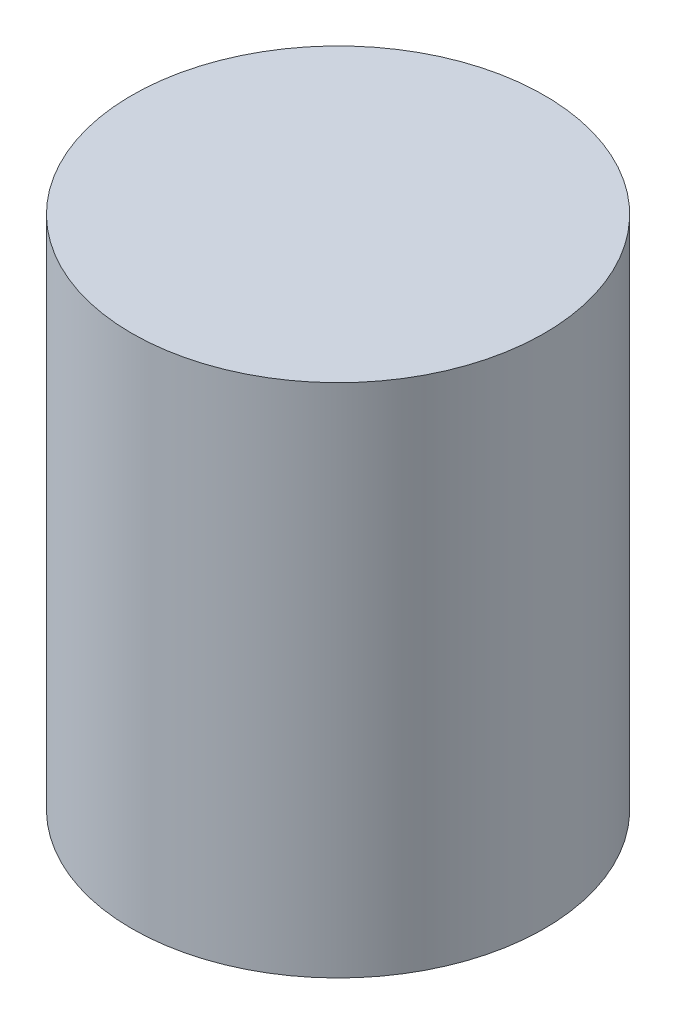
ISO-10303-21;
HEADER;
FILE_DESCRIPTION(('STEP AP214'),'2;1');
FILE_NAME('part.step','',(''),(''),'','','');
FILE_SCHEMA(('AUTOMOTIVE_DESIGN { 1 0 10303 214 1 1 1 1 }'));
ENDSEC;
DATA;
#1=APPLICATION_CONTEXT('core data for automotive mechanical design processes');
#2=APPLICATION_PROTOCOL_DEFINITION('international standard','automotive_design',2000,#1);
#3=PRODUCT_CONTEXT('',#1,'mechanical');
#4=PRODUCT('Part','Part','',(#3));
#5=PRODUCT_RELATED_PRODUCT_CATEGORY('part','',(#4));
#6=PRODUCT_DEFINITION_FORMATION('','',#4);
#7=PRODUCT_DEFINITION_CONTEXT('part definition',#1,'design');
#8=PRODUCT_DEFINITION('design','',#6,#7);
#9=PRODUCT_DEFINITION_SHAPE('','',#8);
#10=(LENGTH_UNIT() NAMED_UNIT(*) SI_UNIT(.MILLI.,.METRE.));
#11=(NAMED_UNIT(*) PLANE_ANGLE_UNIT() SI_UNIT($,.RADIAN.));
#12=(NAMED_UNIT(*) SI_UNIT($,.STERADIAN.) SOLID_ANGLE_UNIT());
#13=UNCERTAINTY_MEASURE_WITH_UNIT(LENGTH_MEASURE(1.E-05),#10,'distance_accuracy_value','');
#14=(GEOMETRIC_REPRESENTATION_CONTEXT(3) GLOBAL_UNCERTAINTY_ASSIGNED_CONTEXT((#13)) GLOBAL_UNIT_ASSIGNED_CONTEXT((#10,
#11,#12)) REPRESENTATION_CONTEXT('',''));
#15=CARTESIAN_POINT('',(0.,0.,0.));
#16=DIRECTION('',(0.,0.,1.));
#17=DIRECTION('',(1.,0.,0.));
#18=AXIS2_PLACEMENT_3D('',#15,#16,#17);
#19=CARTESIAN_POINT('',(0.,500.,1.11022302462516E-13));
#20=DIRECTION('',(0.,-1.,0.));
#21=DIRECTION('',(0.,0.,-1.));
#22=AXIS2_PLACEMENT_3D('',#19,#20,#21);
#23=CYLINDRICAL_SURFACE('',#22,400.);
#24=CARTESIAN_POINT('',(0.,500.,1.11022302462516E-13));
#25=DIRECTION('',(0.,1.,0.));
#26=DIRECTION('',(0.,0.,1.));
#27=AXIS2_PLACEMENT_3D('',#24,#25,#26);
#28=CIRCLE('',#27,400.);
#29=CARTESIAN_POINT('',(0.,500.,400.));
#30=VERTEX_POINT('',#29);
#31=EDGE_CURVE('E10',#30,#30,#28,.T.);
#32=ORIENTED_EDGE('',*,*,#31,.F.);
#33=EDGE_LOOP('',(#32));
#34=FACE_BOUND('',#33,.T.);
#35=CARTESIAN_POINT('',(0.,-500.,1.11022302462516E-13));
#36=DIRECTION('',(0.,1.,0.));
#37=DIRECTION('',(0.,0.,1.));
#38=AXIS2_PLACEMENT_3D('',#35,#36,#37);
#39=CIRCLE('',#38,400.);
#40=CARTESIAN_POINT('',(0.,-500.,400.));
#41=VERTEX_POINT('',#40);
#42=EDGE_CURVE('E38',#41,#41,#39,.T.);
#43=ORIENTED_EDGE('',*,*,#42,.T.);
#44=EDGE_LOOP('',(#43));
#45=FACE_BOUND('',#44,.T.);
#46=ADVANCED_FACE('F35',(#34,#45),#23,.T.);
#47=CARTESIAN_POINT('',(0.,500.,1.11022302462516E-13));
#48=DIRECTION('',(0.,1.,0.));
#49=DIRECTION('',(0.,0.,1.));
#50=AXIS2_PLACEMENT_3D('',#47,#48,#49);
#51=PLANE('',#50);
#52=ORIENTED_EDGE('',*,*,#31,.T.);
#53=EDGE_LOOP('',(#52));
#54=FACE_BOUND('',#53,.T.);
#55=ADVANCED_FACE('F50',(#54),#51,.T.);
#56=CARTESIAN_POINT('',(0.,-500.,1.11022302462516E-13));
#57=DIRECTION('',(0.,1.,0.));
#58=DIRECTION('',(0.,0.,1.));
#59=AXIS2_PLACEMENT_3D('',#56,#57,#58);
#60=PLANE('',#59);
#61=ORIENTED_EDGE('',*,*,#42,.F.);
#62=EDGE_LOOP('',(#61));
#63=FACE_BOUND('',#62,.T.);
#64=ADVANCED_FACE('F48',(#63),#60,.F.);
#65=CLOSED_SHELL('',(#46,#55,#64));
#66=MANIFOLD_SOLID_BREP('B2',#65);
#67=ADVANCED_BREP_SHAPE_REPRESENTATION('',(#18,#66),#14);
#68=SHAPE_DEFINITION_REPRESENTATION(#9,#67);
ENDSEC;
END-ISO-10303-21;
